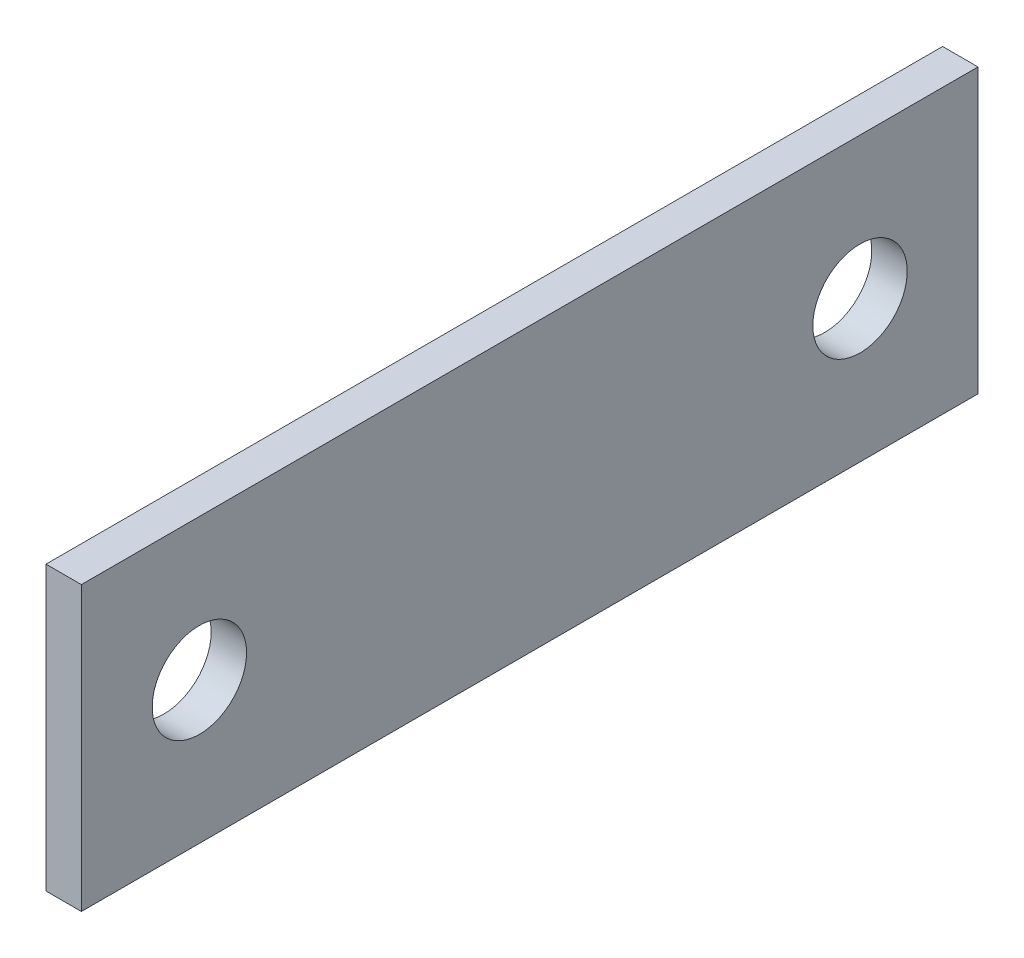
ISO-10303-21;
HEADER;
FILE_DESCRIPTION(('STEP AP214'),'2;1');
FILE_NAME('part.step','',(''),(''),'','','');
FILE_SCHEMA(('AUTOMOTIVE_DESIGN { 1 0 10303 214 1 1 1 1 }'));
ENDSEC;
DATA;
#1=APPLICATION_CONTEXT('core data for automotive mechanical design processes');
#2=APPLICATION_PROTOCOL_DEFINITION('international standard','automotive_design',2000,#1);
#3=PRODUCT_CONTEXT('',#1,'mechanical');
#4=PRODUCT('Part','Part','',(#3));
#5=PRODUCT_RELATED_PRODUCT_CATEGORY('part','',(#4));
#6=PRODUCT_DEFINITION_FORMATION('','',#4);
#7=PRODUCT_DEFINITION_CONTEXT('part definition',#1,'design');
#8=PRODUCT_DEFINITION('design','',#6,#7);
#9=PRODUCT_DEFINITION_SHAPE('','',#8);
#10=(LENGTH_UNIT() NAMED_UNIT(*) SI_UNIT(.MILLI.,.METRE.));
#11=(NAMED_UNIT(*) PLANE_ANGLE_UNIT() SI_UNIT($,.RADIAN.));
#12=(NAMED_UNIT(*) SI_UNIT($,.STERADIAN.) SOLID_ANGLE_UNIT());
#13=UNCERTAINTY_MEASURE_WITH_UNIT(LENGTH_MEASURE(1.E-05),#10,'distance_accuracy_value','');
#14=(GEOMETRIC_REPRESENTATION_CONTEXT(3) GLOBAL_UNCERTAINTY_ASSIGNED_CONTEXT((#13)) GLOBAL_UNIT_ASSIGNED_CONTEXT((#10,
#11,#12)) REPRESENTATION_CONTEXT('',''));
#15=CARTESIAN_POINT('',(0.,0.,0.));
#16=DIRECTION('',(0.,0.,1.));
#17=DIRECTION('',(1.,0.,0.));
#18=AXIS2_PLACEMENT_3D('',#15,#16,#17);
#19=CARTESIAN_POINT('',(1.5,0.,0.));
#20=DIRECTION('',(1.,0.,0.));
#21=DIRECTION('',(0.,0.,-1.));
#22=AXIS2_PLACEMENT_3D('',#19,#20,#21);
#23=PLANE('',#22);
#24=CARTESIAN_POINT('',(1.5,0.,14.));
#25=DIRECTION('',(1.,0.,0.));
#26=DIRECTION('',(0.,0.,-1.));
#27=AXIS2_PLACEMENT_3D('',#24,#25,#26);
#28=CIRCLE('',#27,2.);
#29=CARTESIAN_POINT('',(1.5,0.,12.));
#30=VERTEX_POINT('',#29);
#31=EDGE_CURVE('E104',#30,#30,#28,.T.);
#32=ORIENTED_EDGE('',*,*,#31,.F.);
#33=EDGE_LOOP('',(#32));
#34=FACE_BOUND('',#33,.T.);
#35=DIRECTION('',(0.,0.,-1.));
#36=VECTOR('',#35,1.);
#37=CARTESIAN_POINT('',(1.5,-6.,19.));
#38=LINE('',#37,#36);
#39=CARTESIAN_POINT('',(1.5,-6.,19.));
#40=VERTEX_POINT('',#39);
#41=CARTESIAN_POINT('',(1.5,-6.,-19.));
#42=VERTEX_POINT('',#41);
#43=EDGE_CURVE('E89',#40,#42,#38,.T.);
#44=ORIENTED_EDGE('',*,*,#43,.T.);
#45=DIRECTION('',(0.,1.,0.));
#46=VECTOR('',#45,1.);
#47=CARTESIAN_POINT('',(1.5,-6.,-19.));
#48=LINE('',#47,#46);
#49=CARTESIAN_POINT('',(1.5,6.,-19.));
#50=VERTEX_POINT('',#49);
#51=EDGE_CURVE('E84',#42,#50,#48,.T.);
#52=ORIENTED_EDGE('',*,*,#51,.T.);
#53=DIRECTION('',(0.,0.,1.));
#54=VECTOR('',#53,1.);
#55=CARTESIAN_POINT('',(1.5,6.,19.));
#56=LINE('',#55,#54);
#57=CARTESIAN_POINT('',(1.5,6.,19.));
#58=VERTEX_POINT('',#57);
#59=EDGE_CURVE('E87',#50,#58,#56,.T.);
#60=ORIENTED_EDGE('',*,*,#59,.T.);
#61=DIRECTION('',(0.,-1.,0.));
#62=VECTOR('',#61,1.);
#63=CARTESIAN_POINT('',(1.5,-6.,19.));
#64=LINE('',#63,#62);
#65=EDGE_CURVE('E54',#58,#40,#64,.T.);
#66=ORIENTED_EDGE('',*,*,#65,.T.);
#67=EDGE_LOOP('',(#44,#52,#60,#66));
#68=FACE_BOUND('',#67,.T.);
#69=CARTESIAN_POINT('',(1.5,0.,-14.));
#70=DIRECTION('',(1.,0.,0.));
#71=DIRECTION('',(0.,0.,1.));
#72=AXIS2_PLACEMENT_3D('',#69,#70,#71);
#73=CIRCLE('',#72,2.);
#74=CARTESIAN_POINT('',(1.5,0.,-12.));
#75=VERTEX_POINT('',#74);
#76=EDGE_CURVE('E119',#75,#75,#73,.T.);
#77=ORIENTED_EDGE('',*,*,#76,.F.);
#78=EDGE_LOOP('',(#77));
#79=FACE_BOUND('',#78,.T.);
#80=ADVANCED_FACE('F37',(#34,#68,#79),#23,.T.);
#81=CARTESIAN_POINT('',(0.,0.,0.));
#82=DIRECTION('',(1.,0.,0.));
#83=DIRECTION('',(0.,0.,-1.));
#84=AXIS2_PLACEMENT_3D('',#81,#82,#83);
#85=PLANE('',#84);
#86=DIRECTION('',(0.,0.,-1.));
#87=VECTOR('',#86,1.);
#88=CARTESIAN_POINT('',(0.,-6.,19.));
#89=LINE('',#88,#87);
#90=CARTESIAN_POINT('',(0.,-6.,19.));
#91=VERTEX_POINT('',#90);
#92=CARTESIAN_POINT('',(0.,-6.,-19.));
#93=VERTEX_POINT('',#92);
#94=EDGE_CURVE('E101',#91,#93,#89,.T.);
#95=ORIENTED_EDGE('',*,*,#94,.F.);
#96=DIRECTION('',(0.,-1.,0.));
#97=VECTOR('',#96,1.);
#98=CARTESIAN_POINT('',(0.,-6.,19.));
#99=LINE('',#98,#97);
#100=CARTESIAN_POINT('',(0.,6.,19.));
#101=VERTEX_POINT('',#100);
#102=EDGE_CURVE('E77',#101,#91,#99,.T.);
#103=ORIENTED_EDGE('',*,*,#102,.F.);
#104=DIRECTION('',(0.,0.,1.));
#105=VECTOR('',#104,1.);
#106=CARTESIAN_POINT('',(0.,6.,19.));
#107=LINE('',#106,#105);
#108=CARTESIAN_POINT('',(0.,6.,-19.));
#109=VERTEX_POINT('',#108);
#110=EDGE_CURVE('E71',#109,#101,#107,.T.);
#111=ORIENTED_EDGE('',*,*,#110,.F.);
#112=DIRECTION('',(0.,1.,0.));
#113=VECTOR('',#112,1.);
#114=CARTESIAN_POINT('',(0.,-6.,-19.));
#115=LINE('',#114,#113);
#116=EDGE_CURVE('E93',#93,#109,#115,.T.);
#117=ORIENTED_EDGE('',*,*,#116,.F.);
#118=EDGE_LOOP('',(#95,#103,#111,#117));
#119=FACE_BOUND('',#118,.T.);
#120=CARTESIAN_POINT('',(0.,0.,14.));
#121=DIRECTION('',(1.,0.,0.));
#122=DIRECTION('',(0.,0.,-1.));
#123=AXIS2_PLACEMENT_3D('',#120,#121,#122);
#124=CIRCLE('',#123,2.);
#125=CARTESIAN_POINT('',(0.,0.,12.));
#126=VERTEX_POINT('',#125);
#127=EDGE_CURVE('E116',#126,#126,#124,.T.);
#128=ORIENTED_EDGE('',*,*,#127,.T.);
#129=EDGE_LOOP('',(#128));
#130=FACE_BOUND('',#129,.T.);
#131=CARTESIAN_POINT('',(0.,0.,-14.));
#132=DIRECTION('',(1.,0.,0.));
#133=DIRECTION('',(0.,0.,1.));
#134=AXIS2_PLACEMENT_3D('',#131,#132,#133);
#135=CIRCLE('',#134,2.);
#136=CARTESIAN_POINT('',(0.,0.,-12.));
#137=VERTEX_POINT('',#136);
#138=EDGE_CURVE('E122',#137,#137,#135,.T.);
#139=ORIENTED_EDGE('',*,*,#138,.T.);
#140=EDGE_LOOP('',(#139));
#141=FACE_BOUND('',#140,.T.);
#142=ADVANCED_FACE('F112',(#119,#130,#141),#85,.F.);
#143=CARTESIAN_POINT('',(1.5,-6.,19.));
#144=DIRECTION('',(0.,1.,0.));
#145=DIRECTION('',(0.,0.,1.));
#146=AXIS2_PLACEMENT_3D('',#143,#144,#145);
#147=PLANE('',#146);
#148=ORIENTED_EDGE('',*,*,#94,.T.);
#149=DIRECTION('',(-1.,0.,0.));
#150=VECTOR('',#149,1.);
#151=CARTESIAN_POINT('',(1.5,-6.,-19.));
#152=LINE('',#151,#150);
#153=EDGE_CURVE('E11',#42,#93,#152,.T.);
#154=ORIENTED_EDGE('',*,*,#153,.F.);
#155=ORIENTED_EDGE('',*,*,#43,.F.);
#156=DIRECTION('',(-1.,0.,0.));
#157=VECTOR('',#156,1.);
#158=CARTESIAN_POINT('',(1.5,-6.,19.));
#159=LINE('',#158,#157);
#160=EDGE_CURVE('E97',#40,#91,#159,.T.);
#161=ORIENTED_EDGE('',*,*,#160,.T.);
#162=EDGE_LOOP('',(#148,#154,#155,#161));
#163=FACE_BOUND('',#162,.T.);
#164=ADVANCED_FACE('F39',(#163),#147,.F.);
#165=CARTESIAN_POINT('',(1.5,-6.,-19.));
#166=DIRECTION('',(0.,0.,1.));
#167=DIRECTION('',(1.,0.,0.));
#168=AXIS2_PLACEMENT_3D('',#165,#166,#167);
#169=PLANE('',#168);
#170=ORIENTED_EDGE('',*,*,#116,.T.);
#171=DIRECTION('',(-1.,0.,0.));
#172=VECTOR('',#171,1.);
#173=CARTESIAN_POINT('',(1.5,6.,-19.));
#174=LINE('',#173,#172);
#175=EDGE_CURVE('E46',#50,#109,#174,.T.);
#176=ORIENTED_EDGE('',*,*,#175,.F.);
#177=ORIENTED_EDGE('',*,*,#51,.F.);
#178=ORIENTED_EDGE('',*,*,#153,.T.);
#179=EDGE_LOOP('',(#170,#176,#177,#178));
#180=FACE_BOUND('',#179,.T.);
#181=ADVANCED_FACE('F92',(#180),#169,.F.);
#182=CARTESIAN_POINT('',(1.5,6.,19.));
#183=DIRECTION('',(0.,-1.,0.));
#184=DIRECTION('',(0.,0.,-1.));
#185=AXIS2_PLACEMENT_3D('',#182,#183,#184);
#186=PLANE('',#185);
#187=ORIENTED_EDGE('',*,*,#110,.T.);
#188=DIRECTION('',(-1.,0.,0.));
#189=VECTOR('',#188,1.);
#190=CARTESIAN_POINT('',(1.5,6.,19.));
#191=LINE('',#190,#189);
#192=EDGE_CURVE('E94',#58,#101,#191,.T.);
#193=ORIENTED_EDGE('',*,*,#192,.F.);
#194=ORIENTED_EDGE('',*,*,#59,.F.);
#195=ORIENTED_EDGE('',*,*,#175,.T.);
#196=EDGE_LOOP('',(#187,#193,#194,#195));
#197=FACE_BOUND('',#196,.T.);
#198=ADVANCED_FACE('F95',(#197),#186,.F.);
#199=CARTESIAN_POINT('',(1.5,-6.,19.));
#200=DIRECTION('',(0.,0.,-1.));
#201=DIRECTION('',(-1.,0.,0.));
#202=AXIS2_PLACEMENT_3D('',#199,#200,#201);
#203=PLANE('',#202);
#204=ORIENTED_EDGE('',*,*,#102,.T.);
#205=ORIENTED_EDGE('',*,*,#160,.F.);
#206=ORIENTED_EDGE('',*,*,#65,.F.);
#207=ORIENTED_EDGE('',*,*,#192,.T.);
#208=EDGE_LOOP('',(#204,#205,#206,#207));
#209=FACE_BOUND('',#208,.T.);
#210=ADVANCED_FACE('F109',(#209),#203,.F.);
#211=CARTESIAN_POINT('',(1.5,0.,14.));
#212=DIRECTION('',(-1.,0.,0.));
#213=DIRECTION('',(0.,0.,1.));
#214=AXIS2_PLACEMENT_3D('',#211,#212,#213);
#215=CYLINDRICAL_SURFACE('',#214,2.);
#216=ORIENTED_EDGE('',*,*,#31,.T.);
#217=EDGE_LOOP('',(#216));
#218=FACE_BOUND('',#217,.T.);
#219=ORIENTED_EDGE('',*,*,#127,.F.);
#220=EDGE_LOOP('',(#219));
#221=FACE_BOUND('',#220,.T.);
#222=ADVANCED_FACE('F139',(#218,#221),#215,.F.);
#223=CARTESIAN_POINT('',(1.5,0.,-14.));
#224=DIRECTION('',(-1.,0.,0.));
#225=DIRECTION('',(0.,0.,1.));
#226=AXIS2_PLACEMENT_3D('',#223,#224,#225);
#227=CYLINDRICAL_SURFACE('',#226,2.);
#228=ORIENTED_EDGE('',*,*,#76,.T.);
#229=EDGE_LOOP('',(#228));
#230=FACE_BOUND('',#229,.T.);
#231=ORIENTED_EDGE('',*,*,#138,.F.);
#232=EDGE_LOOP('',(#231));
#233=FACE_BOUND('',#232,.T.);
#234=ADVANCED_FACE('F128',(#230,#233),#227,.F.);
#235=CLOSED_SHELL('',(#80,#142,#164,#181,#198,#210,#222,#234));
#236=MANIFOLD_SOLID_BREP('B2',#235);
#237=ADVANCED_BREP_SHAPE_REPRESENTATION('',(#18,#236),#14);
#238=SHAPE_DEFINITION_REPRESENTATION(#9,#237);
ENDSEC;
END-ISO-10303-21;
